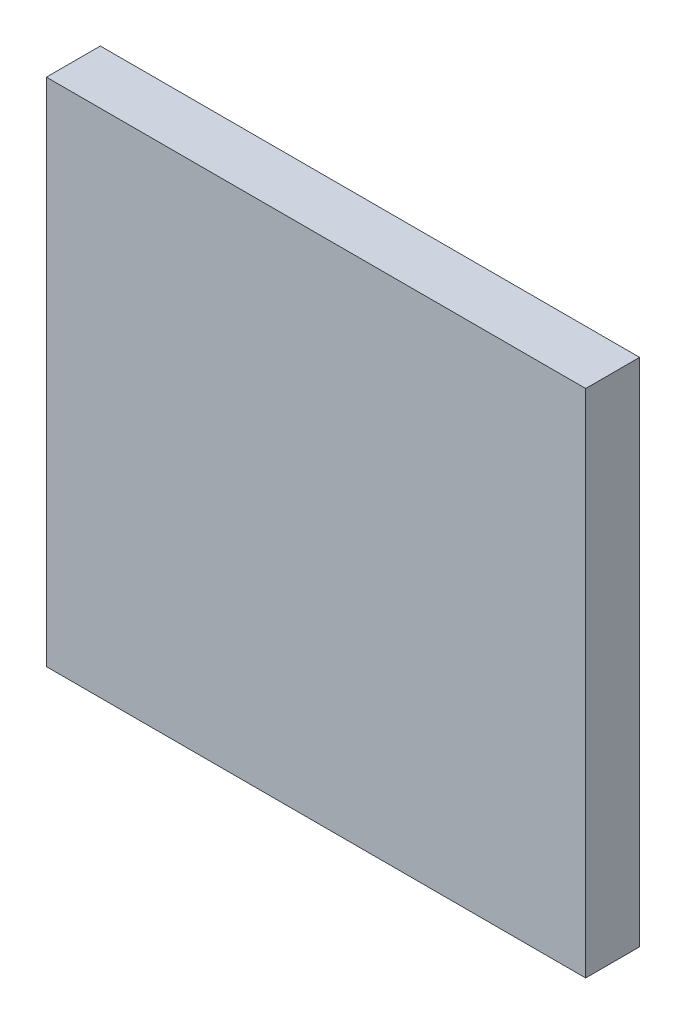
ISO-10303-21;
HEADER;
FILE_DESCRIPTION(('STEP AP214'),'2;1');
FILE_NAME('part.step','',(''),(''),'','','');
FILE_SCHEMA(('AUTOMOTIVE_DESIGN { 1 0 10303 214 1 1 1 1 }'));
ENDSEC;
DATA;
#1=APPLICATION_CONTEXT('core data for automotive mechanical design processes');
#2=APPLICATION_PROTOCOL_DEFINITION('international standard','automotive_design',2000,#1);
#3=PRODUCT_CONTEXT('',#1,'mechanical');
#4=PRODUCT('Part','Part','',(#3));
#5=PRODUCT_RELATED_PRODUCT_CATEGORY('part','',(#4));
#6=PRODUCT_DEFINITION_FORMATION('','',#4);
#7=PRODUCT_DEFINITION_CONTEXT('part definition',#1,'design');
#8=PRODUCT_DEFINITION('design','',#6,#7);
#9=PRODUCT_DEFINITION_SHAPE('','',#8);
#10=(LENGTH_UNIT() NAMED_UNIT(*) SI_UNIT(.MILLI.,.METRE.));
#11=(NAMED_UNIT(*) PLANE_ANGLE_UNIT() SI_UNIT($,.RADIAN.));
#12=(NAMED_UNIT(*) SI_UNIT($,.STERADIAN.) SOLID_ANGLE_UNIT());
#13=UNCERTAINTY_MEASURE_WITH_UNIT(LENGTH_MEASURE(1.E-05),#10,'distance_accuracy_value','');
#14=(GEOMETRIC_REPRESENTATION_CONTEXT(3) GLOBAL_UNCERTAINTY_ASSIGNED_CONTEXT((#13)) GLOBAL_UNIT_ASSIGNED_CONTEXT((#10,
#11,#12)) REPRESENTATION_CONTEXT('',''));
#15=CARTESIAN_POINT('',(0.,0.,0.));
#16=DIRECTION('',(0.,0.,1.));
#17=DIRECTION('',(1.,0.,0.));
#18=AXIS2_PLACEMENT_3D('',#15,#16,#17);
#19=CARTESIAN_POINT('',(0.,0.,0.));
#20=DIRECTION('',(0.,0.,1.));
#21=DIRECTION('',(1.,0.,0.));
#22=AXIS2_PLACEMENT_3D('',#19,#20,#21);
#23=PLANE('',#22);
#24=DIRECTION('',(1.,0.,0.));
#25=VECTOR('',#24,1.);
#26=CARTESIAN_POINT('',(0.,-18.034,0.));
#27=LINE('',#26,#25);
#28=CARTESIAN_POINT('',(28.575,-18.034,0.));
#29=VERTEX_POINT('',#28);
#30=CARTESIAN_POINT('',(66.675,-18.034,0.));
#31=VERTEX_POINT('',#30);
#32=EDGE_CURVE('E57',#29,#31,#27,.T.);
#33=ORIENTED_EDGE('',*,*,#32,.F.);
#34=DIRECTION('',(0.,1.,0.));
#35=VECTOR('',#34,1.);
#36=CARTESIAN_POINT('',(28.575,-18.034,0.));
#37=LINE('',#36,#35);
#38=CARTESIAN_POINT('',(28.575,18.034,0.));
#39=VERTEX_POINT('',#38);
#40=EDGE_CURVE('E84',#29,#39,#37,.T.);
#41=ORIENTED_EDGE('',*,*,#40,.T.);
#42=DIRECTION('',(-1.,0.,0.));
#43=VECTOR('',#42,1.);
#44=CARTESIAN_POINT('',(0.,18.034,0.));
#45=LINE('',#44,#43);
#46=CARTESIAN_POINT('',(66.675,18.034,0.));
#47=VERTEX_POINT('',#46);
#48=EDGE_CURVE('E107',#47,#39,#45,.T.);
#49=ORIENTED_EDGE('',*,*,#48,.F.);
#50=DIRECTION('',(0.,1.,0.));
#51=VECTOR('',#50,1.);
#52=CARTESIAN_POINT('',(66.675,18.034,0.));
#53=LINE('',#52,#51);
#54=EDGE_CURVE('E101',#31,#47,#53,.T.);
#55=ORIENTED_EDGE('',*,*,#54,.F.);
#56=EDGE_LOOP('',(#33,#41,#49,#55));
#57=FACE_BOUND('',#56,.T.);
#58=ADVANCED_FACE('F42',(#57),#23,.F.);
#59=CARTESIAN_POINT('',(0.,18.034,0.));
#60=DIRECTION('',(0.,1.,0.));
#61=DIRECTION('',(0.,0.,1.));
#62=AXIS2_PLACEMENT_3D('',#59,#60,#61);
#63=PLANE('',#62);
#64=DIRECTION('',(0.,0.,-1.));
#65=VECTOR('',#64,1.);
#66=CARTESIAN_POINT('',(28.575,18.034,4.445));
#67=LINE('',#66,#65);
#68=CARTESIAN_POINT('',(28.575,18.034,3.81));
#69=VERTEX_POINT('',#68);
#70=EDGE_CURVE('E89',#69,#39,#67,.T.);
#71=ORIENTED_EDGE('',*,*,#70,.F.);
#72=DIRECTION('',(1.,0.,0.));
#73=VECTOR('',#72,1.);
#74=CARTESIAN_POINT('',(28.575,18.034,3.81));
#75=LINE('',#74,#73);
#76=CARTESIAN_POINT('',(66.675,18.034,3.81));
#77=VERTEX_POINT('',#76);
#78=EDGE_CURVE('E103',#69,#77,#75,.T.);
#79=ORIENTED_EDGE('',*,*,#78,.T.);
#80=DIRECTION('',(0.,0.,1.));
#81=VECTOR('',#80,1.);
#82=CARTESIAN_POINT('',(66.675,18.034,0.));
#83=LINE('',#82,#81);
#84=EDGE_CURVE('E12',#47,#77,#83,.T.);
#85=ORIENTED_EDGE('',*,*,#84,.F.);
#86=ORIENTED_EDGE('',*,*,#48,.T.);
#87=EDGE_LOOP('',(#71,#79,#85,#86));
#88=FACE_BOUND('',#87,.T.);
#89=ADVANCED_FACE('F128',(#88),#63,.T.);
#90=CARTESIAN_POINT('',(66.675,18.034,0.));
#91=DIRECTION('',(1.,0.,0.));
#92=DIRECTION('',(0.,0.,-1.));
#93=AXIS2_PLACEMENT_3D('',#90,#91,#92);
#94=PLANE('',#93);
#95=DIRECTION('',(0.,1.,0.));
#96=VECTOR('',#95,1.);
#97=CARTESIAN_POINT('',(66.675,-18.034,3.81));
#98=LINE('',#97,#96);
#99=CARTESIAN_POINT('',(66.675,-18.034,3.81));
#100=VERTEX_POINT('',#99);
#101=EDGE_CURVE('E93',#100,#77,#98,.T.);
#102=ORIENTED_EDGE('',*,*,#101,.F.);
#103=DIRECTION('',(0.,0.,1.));
#104=VECTOR('',#103,1.);
#105=CARTESIAN_POINT('',(66.675,-18.034,0.));
#106=LINE('',#105,#104);
#107=EDGE_CURVE('E45',#31,#100,#106,.T.);
#108=ORIENTED_EDGE('',*,*,#107,.F.);
#109=ORIENTED_EDGE('',*,*,#54,.T.);
#110=ORIENTED_EDGE('',*,*,#84,.T.);
#111=EDGE_LOOP('',(#102,#108,#109,#110));
#112=FACE_BOUND('',#111,.T.);
#113=ADVANCED_FACE('F116',(#112),#94,.T.);
#114=CARTESIAN_POINT('',(0.,-18.034,0.));
#115=DIRECTION('',(0.,-1.,0.));
#116=DIRECTION('',(0.,0.,-1.));
#117=AXIS2_PLACEMENT_3D('',#114,#115,#116);
#118=PLANE('',#117);
#119=DIRECTION('',(0.,0.,-1.));
#120=VECTOR('',#119,1.);
#121=CARTESIAN_POINT('',(28.575,-18.034,4.445));
#122=LINE('',#121,#120);
#123=CARTESIAN_POINT('',(28.575,-18.034,3.81));
#124=VERTEX_POINT('',#123);
#125=EDGE_CURVE('E86',#124,#29,#122,.T.);
#126=ORIENTED_EDGE('',*,*,#125,.T.);
#127=ORIENTED_EDGE('',*,*,#32,.T.);
#128=ORIENTED_EDGE('',*,*,#107,.T.);
#129=DIRECTION('',(1.,0.,0.));
#130=VECTOR('',#129,1.);
#131=CARTESIAN_POINT('',(28.575,-18.034,3.81));
#132=LINE('',#131,#130);
#133=EDGE_CURVE('E97',#124,#100,#132,.T.);
#134=ORIENTED_EDGE('',*,*,#133,.F.);
#135=EDGE_LOOP('',(#126,#127,#128,#134));
#136=FACE_BOUND('',#135,.T.);
#137=ADVANCED_FACE('F96',(#136),#118,.T.);
#138=CARTESIAN_POINT('',(28.575,-18.034,3.81));
#139=DIRECTION('',(0.,0.,-1.));
#140=DIRECTION('',(-1.,0.,0.));
#141=AXIS2_PLACEMENT_3D('',#138,#139,#140);
#142=PLANE('',#141);
#143=ORIENTED_EDGE('',*,*,#101,.T.);
#144=ORIENTED_EDGE('',*,*,#78,.F.);
#145=DIRECTION('',(0.,1.,0.));
#146=VECTOR('',#145,1.);
#147=CARTESIAN_POINT('',(28.575,-18.034,3.81));
#148=LINE('',#147,#146);
#149=EDGE_CURVE('E120',#124,#69,#148,.T.);
#150=ORIENTED_EDGE('',*,*,#149,.F.);
#151=ORIENTED_EDGE('',*,*,#133,.T.);
#152=EDGE_LOOP('',(#143,#144,#150,#151));
#153=FACE_BOUND('',#152,.T.);
#154=ADVANCED_FACE('F127',(#153),#142,.F.);
#155=CARTESIAN_POINT('',(28.575,-18.034,4.445));
#156=DIRECTION('',(1.,0.,0.));
#157=DIRECTION('',(0.,0.,-1.));
#158=AXIS2_PLACEMENT_3D('',#155,#156,#157);
#159=PLANE('',#158);
#160=ORIENTED_EDGE('',*,*,#70,.T.);
#161=ORIENTED_EDGE('',*,*,#40,.F.);
#162=ORIENTED_EDGE('',*,*,#125,.F.);
#163=ORIENTED_EDGE('',*,*,#149,.T.);
#164=EDGE_LOOP('',(#160,#161,#162,#163));
#165=FACE_BOUND('',#164,.T.);
#166=ADVANCED_FACE('F85',(#165),#159,.F.);
#167=CLOSED_SHELL('',(#58,#89,#113,#137,#154,#166));
#168=MANIFOLD_SOLID_BREP('B2',#167);
#169=ADVANCED_BREP_SHAPE_REPRESENTATION('',(#18,#168),#14);
#170=SHAPE_DEFINITION_REPRESENTATION(#9,#169);
ENDSEC;
END-ISO-10303-21;
